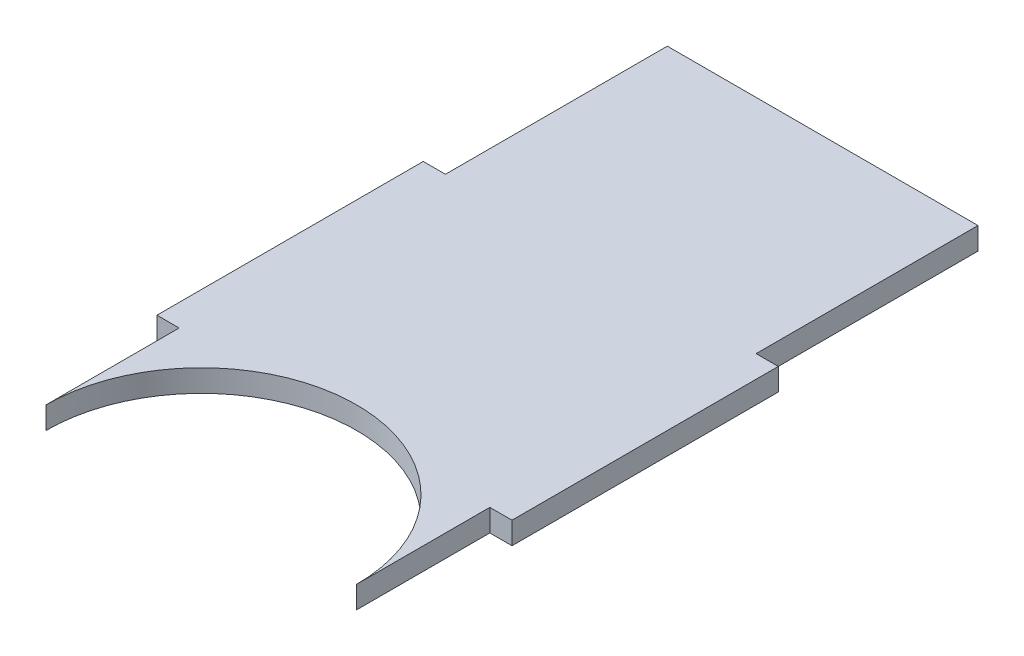
ISO-10303-21;
HEADER;
FILE_DESCRIPTION(('STEP AP214'),'2;1');
FILE_NAME('part.step','',(''),(''),'','','');
FILE_SCHEMA(('AUTOMOTIVE_DESIGN { 1 0 10303 214 1 1 1 1 }'));
ENDSEC;
DATA;
#1=APPLICATION_CONTEXT('core data for automotive mechanical design processes');
#2=APPLICATION_PROTOCOL_DEFINITION('international standard','automotive_design',2000,#1);
#3=PRODUCT_CONTEXT('',#1,'mechanical');
#4=PRODUCT('Part','Part','',(#3));
#5=PRODUCT_RELATED_PRODUCT_CATEGORY('part','',(#4));
#6=PRODUCT_DEFINITION_FORMATION('','',#4);
#7=PRODUCT_DEFINITION_CONTEXT('part definition',#1,'design');
#8=PRODUCT_DEFINITION('design','',#6,#7);
#9=PRODUCT_DEFINITION_SHAPE('','',#8);
#10=(LENGTH_UNIT() NAMED_UNIT(*) SI_UNIT(.MILLI.,.METRE.));
#11=(NAMED_UNIT(*) PLANE_ANGLE_UNIT() SI_UNIT($,.RADIAN.));
#12=(NAMED_UNIT(*) SI_UNIT($,.STERADIAN.) SOLID_ANGLE_UNIT());
#13=UNCERTAINTY_MEASURE_WITH_UNIT(LENGTH_MEASURE(1.E-05),#10,'distance_accuracy_value','');
#14=(GEOMETRIC_REPRESENTATION_CONTEXT(3) GLOBAL_UNCERTAINTY_ASSIGNED_CONTEXT((#13)) GLOBAL_UNIT_ASSIGNED_CONTEXT((#10,
#11,#12)) REPRESENTATION_CONTEXT('',''));
#15=CARTESIAN_POINT('',(0.,0.,0.));
#16=DIRECTION('',(0.,0.,1.));
#17=DIRECTION('',(1.,0.,0.));
#18=AXIS2_PLACEMENT_3D('',#15,#16,#17);
#19=CARTESIAN_POINT('',(0.,1.5875,19.05));
#20=DIRECTION('',(0.,-1.,0.));
#21=DIRECTION('',(0.,0.,-1.));
#22=AXIS2_PLACEMENT_3D('',#19,#20,#21);
#23=CYLINDRICAL_SURFACE('',#22,11.1125);
#24=CARTESIAN_POINT('',(0.,0.,19.05));
#25=DIRECTION('',(0.,1.,0.));
#26=DIRECTION('',(0.,0.,1.));
#27=AXIS2_PLACEMENT_3D('',#24,#25,#26);
#28=CIRCLE('',#27,11.1125);
#29=CARTESIAN_POINT('',(11.1125,0.,19.05));
#30=VERTEX_POINT('',#29);
#31=CARTESIAN_POINT('',(-11.1125,0.,19.05));
#32=VERTEX_POINT('',#31);
#33=EDGE_CURVE('E187',#30,#32,#28,.T.);
#34=ORIENTED_EDGE('',*,*,#33,.F.);
#35=DIRECTION('',(0.,-1.,0.));
#36=VECTOR('',#35,1.);
#37=CARTESIAN_POINT('',(11.1125,1.5875,19.05));
#38=LINE('',#37,#36);
#39=CARTESIAN_POINT('',(11.1125,1.5875,19.05));
#40=VERTEX_POINT('',#39);
#41=EDGE_CURVE('E11',#40,#30,#38,.T.);
#42=ORIENTED_EDGE('',*,*,#41,.F.);
#43=CARTESIAN_POINT('',(0.,1.5875,19.05));
#44=DIRECTION('',(0.,1.,0.));
#45=DIRECTION('',(0.,0.,1.));
#46=AXIS2_PLACEMENT_3D('',#43,#44,#45);
#47=CIRCLE('',#46,11.1125);
#48=CARTESIAN_POINT('',(-11.1125,1.5875,19.05));
#49=VERTEX_POINT('',#48);
#50=EDGE_CURVE('E266',#40,#49,#47,.T.);
#51=ORIENTED_EDGE('',*,*,#50,.T.);
#52=DIRECTION('',(0.,-1.,0.));
#53=VECTOR('',#52,1.);
#54=CARTESIAN_POINT('',(-11.1125,1.5875,19.05));
#55=LINE('',#54,#53);
#56=EDGE_CURVE('E119',#49,#32,#55,.T.);
#57=ORIENTED_EDGE('',*,*,#56,.T.);
#58=EDGE_LOOP('',(#34,#42,#51,#57));
#59=FACE_BOUND('',#58,.T.);
#60=ADVANCED_FACE('F40',(#59),#23,.F.);
#61=CARTESIAN_POINT('',(11.1125,1.5875,0.));
#62=DIRECTION('',(1.,0.,0.));
#63=DIRECTION('',(0.,0.,-1.));
#64=AXIS2_PLACEMENT_3D('',#61,#62,#63);
#65=PLANE('',#64);
#66=DIRECTION('',(0.,0.,1.));
#67=VECTOR('',#66,1.);
#68=CARTESIAN_POINT('',(11.1125,0.,0.));
#69=LINE('',#68,#67);
#70=CARTESIAN_POINT('',(11.1125,0.,9.525));
#71=VERTEX_POINT('',#70);
#72=EDGE_CURVE('E191',#71,#30,#69,.T.);
#73=ORIENTED_EDGE('',*,*,#72,.F.);
#74=DIRECTION('',(0.,-1.,0.));
#75=VECTOR('',#74,1.);
#76=CARTESIAN_POINT('',(11.1125,1.5875,9.525));
#77=LINE('',#76,#75);
#78=CARTESIAN_POINT('',(11.1125,1.5875,9.525));
#79=VERTEX_POINT('',#78);
#80=EDGE_CURVE('E49',#79,#71,#77,.T.);
#81=ORIENTED_EDGE('',*,*,#80,.F.);
#82=DIRECTION('',(0.,0.,1.));
#83=VECTOR('',#82,1.);
#84=CARTESIAN_POINT('',(11.1125,1.5875,0.));
#85=LINE('',#84,#83);
#86=EDGE_CURVE('E264',#79,#40,#85,.T.);
#87=ORIENTED_EDGE('',*,*,#86,.T.);
#88=ORIENTED_EDGE('',*,*,#41,.T.);
#89=EDGE_LOOP('',(#73,#81,#87,#88));
#90=FACE_BOUND('',#89,.T.);
#91=ADVANCED_FACE('F263',(#90),#65,.T.);
#92=CARTESIAN_POINT('',(0.,1.5875,9.52500000000003));
#93=DIRECTION('',(0.,0.,-1.));
#94=DIRECTION('',(-1.,0.,0.));
#95=AXIS2_PLACEMENT_3D('',#92,#93,#94);
#96=PLANE('',#95);
#97=DIRECTION('',(1.,0.,0.));
#98=VECTOR('',#97,1.);
#99=CARTESIAN_POINT('',(0.,0.,9.52500000000003));
#100=LINE('',#99,#98);
#101=CARTESIAN_POINT('',(12.7,0.,9.525));
#102=VERTEX_POINT('',#101);
#103=EDGE_CURVE('E195',#71,#102,#100,.T.);
#104=ORIENTED_EDGE('',*,*,#103,.T.);
#105=DIRECTION('',(0.,-1.,0.));
#106=VECTOR('',#105,1.);
#107=CARTESIAN_POINT('',(12.7,1.5875,9.525));
#108=LINE('',#107,#106);
#109=CARTESIAN_POINT('',(12.7,1.5875,9.525));
#110=VERTEX_POINT('',#109);
#111=EDGE_CURVE('E245',#110,#102,#108,.T.);
#112=ORIENTED_EDGE('',*,*,#111,.F.);
#113=DIRECTION('',(1.,0.,0.));
#114=VECTOR('',#113,1.);
#115=CARTESIAN_POINT('',(0.,1.5875,9.52500000000003));
#116=LINE('',#115,#114);
#117=EDGE_CURVE('E255',#79,#110,#116,.T.);
#118=ORIENTED_EDGE('',*,*,#117,.F.);
#119=ORIENTED_EDGE('',*,*,#80,.T.);
#120=EDGE_LOOP('',(#104,#112,#118,#119));
#121=FACE_BOUND('',#120,.T.);
#122=ADVANCED_FACE('F253',(#121),#96,.F.);
#123=CARTESIAN_POINT('',(12.7,1.5875,0.));
#124=DIRECTION('',(-1.,0.,0.));
#125=DIRECTION('',(0.,0.,1.));
#126=AXIS2_PLACEMENT_3D('',#123,#124,#125);
#127=PLANE('',#126);
#128=DIRECTION('',(0.,0.,-1.));
#129=VECTOR('',#128,1.);
#130=CARTESIAN_POINT('',(12.7,0.,0.));
#131=LINE('',#130,#129);
#132=CARTESIAN_POINT('',(12.7,0.,-9.525));
#133=VERTEX_POINT('',#132);
#134=EDGE_CURVE('E199',#102,#133,#131,.T.);
#135=ORIENTED_EDGE('',*,*,#134,.T.);
#136=DIRECTION('',(0.,-1.,0.));
#137=VECTOR('',#136,1.);
#138=CARTESIAN_POINT('',(12.7,1.5875,-9.525));
#139=LINE('',#138,#137);
#140=CARTESIAN_POINT('',(12.7,1.5875,-9.525));
#141=VERTEX_POINT('',#140);
#142=EDGE_CURVE('E242',#141,#133,#139,.T.);
#143=ORIENTED_EDGE('',*,*,#142,.F.);
#144=DIRECTION('',(0.,0.,-1.));
#145=VECTOR('',#144,1.);
#146=CARTESIAN_POINT('',(12.7,1.5875,0.));
#147=LINE('',#146,#145);
#148=EDGE_CURVE('E275',#110,#141,#147,.T.);
#149=ORIENTED_EDGE('',*,*,#148,.F.);
#150=ORIENTED_EDGE('',*,*,#111,.T.);
#151=EDGE_LOOP('',(#135,#143,#149,#150));
#152=FACE_BOUND('',#151,.T.);
#153=ADVANCED_FACE('F312',(#152),#127,.F.);
#154=CARTESIAN_POINT('',(0.,1.5875,-9.52500000000003));
#155=DIRECTION('',(0.,0.,-1.));
#156=DIRECTION('',(-1.,0.,0.));
#157=AXIS2_PLACEMENT_3D('',#154,#155,#156);
#158=PLANE('',#157);
#159=DIRECTION('',(1.,0.,0.));
#160=VECTOR('',#159,1.);
#161=CARTESIAN_POINT('',(0.,0.,-9.52500000000003));
#162=LINE('',#161,#160);
#163=CARTESIAN_POINT('',(11.1125,0.,-9.525));
#164=VERTEX_POINT('',#163);
#165=EDGE_CURVE('E203',#164,#133,#162,.T.);
#166=ORIENTED_EDGE('',*,*,#165,.F.);
#167=DIRECTION('',(0.,-1.,0.));
#168=VECTOR('',#167,1.);
#169=CARTESIAN_POINT('',(11.1125,1.5875,-9.525));
#170=LINE('',#169,#168);
#171=CARTESIAN_POINT('',(11.1125,1.5875,-9.525));
#172=VERTEX_POINT('',#171);
#173=EDGE_CURVE('E239',#172,#164,#170,.T.);
#174=ORIENTED_EDGE('',*,*,#173,.F.);
#175=DIRECTION('',(1.,0.,0.));
#176=VECTOR('',#175,1.);
#177=CARTESIAN_POINT('',(0.,1.5875,-9.52500000000003));
#178=LINE('',#177,#176);
#179=EDGE_CURVE('E277',#172,#141,#178,.T.);
#180=ORIENTED_EDGE('',*,*,#179,.T.);
#181=ORIENTED_EDGE('',*,*,#142,.T.);
#182=EDGE_LOOP('',(#166,#174,#180,#181));
#183=FACE_BOUND('',#182,.T.);
#184=ADVANCED_FACE('F310',(#183),#158,.T.);
#185=CARTESIAN_POINT('',(11.1125,0.,-25.4));
#186=VERTEX_POINT('',#185);
#187=EDGE_CURVE('E196',#186,#164,#69,.T.);
#188=ORIENTED_EDGE('',*,*,#187,.F.);
#189=DIRECTION('',(0.,-1.,0.));
#190=VECTOR('',#189,1.);
#191=CARTESIAN_POINT('',(11.1125,1.5875,-25.4));
#192=LINE('',#191,#190);
#193=CARTESIAN_POINT('',(11.1125,1.5875,-25.4));
#194=VERTEX_POINT('',#193);
#195=EDGE_CURVE('E236',#194,#186,#192,.T.);
#196=ORIENTED_EDGE('',*,*,#195,.F.);
#197=EDGE_CURVE('E271',#194,#172,#85,.T.);
#198=ORIENTED_EDGE('',*,*,#197,.T.);
#199=ORIENTED_EDGE('',*,*,#173,.T.);
#200=EDGE_LOOP('',(#188,#196,#198,#199));
#201=FACE_BOUND('',#200,.T.);
#202=ADVANCED_FACE('F301',(#201),#65,.T.);
#203=CARTESIAN_POINT('',(0.,1.5875,-25.4));
#204=DIRECTION('',(0.,0.,1.));
#205=DIRECTION('',(1.,0.,0.));
#206=AXIS2_PLACEMENT_3D('',#203,#204,#205);
#207=PLANE('',#206);
#208=DIRECTION('',(-1.,0.,0.));
#209=VECTOR('',#208,1.);
#210=CARTESIAN_POINT('',(0.,0.,-25.4));
#211=LINE('',#210,#209);
#212=CARTESIAN_POINT('',(-11.1125,0.,-25.4));
#213=VERTEX_POINT('',#212);
#214=EDGE_CURVE('E207',#186,#213,#211,.T.);
#215=ORIENTED_EDGE('',*,*,#214,.T.);
#216=DIRECTION('',(0.,-1.,0.));
#217=VECTOR('',#216,1.);
#218=CARTESIAN_POINT('',(-11.1125,1.5875,-25.4));
#219=LINE('',#218,#217);
#220=CARTESIAN_POINT('',(-11.1125,1.5875,-25.4));
#221=VERTEX_POINT('',#220);
#222=EDGE_CURVE('E232',#221,#213,#219,.T.);
#223=ORIENTED_EDGE('',*,*,#222,.F.);
#224=DIRECTION('',(-1.,0.,0.));
#225=VECTOR('',#224,1.);
#226=CARTESIAN_POINT('',(0.,1.5875,-25.4));
#227=LINE('',#226,#225);
#228=EDGE_CURVE('E281',#194,#221,#227,.T.);
#229=ORIENTED_EDGE('',*,*,#228,.F.);
#230=ORIENTED_EDGE('',*,*,#195,.T.);
#231=EDGE_LOOP('',(#215,#223,#229,#230));
#232=FACE_BOUND('',#231,.T.);
#233=ADVANCED_FACE('F329',(#232),#207,.F.);
#234=CARTESIAN_POINT('',(-11.1125,1.5875,0.));
#235=DIRECTION('',(1.,0.,0.));
#236=DIRECTION('',(0.,0.,-1.));
#237=AXIS2_PLACEMENT_3D('',#234,#235,#236);
#238=PLANE('',#237);
#239=DIRECTION('',(0.,0.,1.));
#240=VECTOR('',#239,1.);
#241=CARTESIAN_POINT('',(-11.1125,0.,0.));
#242=LINE('',#241,#240);
#243=CARTESIAN_POINT('',(-11.1125,0.,-9.525));
#244=VERTEX_POINT('',#243);
#245=EDGE_CURVE('E210',#213,#244,#242,.T.);
#246=ORIENTED_EDGE('',*,*,#245,.T.);
#247=DIRECTION('',(0.,-1.,0.));
#248=VECTOR('',#247,1.);
#249=CARTESIAN_POINT('',(-11.1125,1.5875,-9.525));
#250=LINE('',#249,#248);
#251=CARTESIAN_POINT('',(-11.1125,1.5875,-9.525));
#252=VERTEX_POINT('',#251);
#253=EDGE_CURVE('E228',#252,#244,#250,.T.);
#254=ORIENTED_EDGE('',*,*,#253,.F.);
#255=DIRECTION('',(0.,0.,1.));
#256=VECTOR('',#255,1.);
#257=CARTESIAN_POINT('',(-11.1125,1.5875,0.));
#258=LINE('',#257,#256);
#259=EDGE_CURVE('E184',#221,#252,#258,.T.);
#260=ORIENTED_EDGE('',*,*,#259,.F.);
#261=ORIENTED_EDGE('',*,*,#222,.T.);
#262=EDGE_LOOP('',(#246,#254,#260,#261));
#263=FACE_BOUND('',#262,.T.);
#264=ADVANCED_FACE('F291',(#263),#238,.F.);
#265=CARTESIAN_POINT('',(0.,1.5875,-9.52500000000003));
#266=DIRECTION('',(0.,0.,1.));
#267=DIRECTION('',(1.,0.,0.));
#268=AXIS2_PLACEMENT_3D('',#265,#266,#267);
#269=PLANE('',#268);
#270=DIRECTION('',(-1.,0.,0.));
#271=VECTOR('',#270,1.);
#272=CARTESIAN_POINT('',(0.,0.,-9.52500000000003));
#273=LINE('',#272,#271);
#274=CARTESIAN_POINT('',(-12.7,0.,-9.525));
#275=VERTEX_POINT('',#274);
#276=EDGE_CURVE('E213',#244,#275,#273,.T.);
#277=ORIENTED_EDGE('',*,*,#276,.T.);
#278=DIRECTION('',(0.,-1.,0.));
#279=VECTOR('',#278,1.);
#280=CARTESIAN_POINT('',(-12.7,1.5875,-9.525));
#281=LINE('',#280,#279);
#282=CARTESIAN_POINT('',(-12.7,1.5875,-9.525));
#283=VERTEX_POINT('',#282);
#284=EDGE_CURVE('E169',#283,#275,#281,.T.);
#285=ORIENTED_EDGE('',*,*,#284,.F.);
#286=DIRECTION('',(-1.,0.,0.));
#287=VECTOR('',#286,1.);
#288=CARTESIAN_POINT('',(0.,1.5875,-9.52500000000003));
#289=LINE('',#288,#287);
#290=EDGE_CURVE('E174',#252,#283,#289,.T.);
#291=ORIENTED_EDGE('',*,*,#290,.F.);
#292=ORIENTED_EDGE('',*,*,#253,.T.);
#293=EDGE_LOOP('',(#277,#285,#291,#292));
#294=FACE_BOUND('',#293,.T.);
#295=ADVANCED_FACE('F295',(#294),#269,.F.);
#296=CARTESIAN_POINT('',(-12.7,1.5875,0.));
#297=DIRECTION('',(-1.,0.,0.));
#298=DIRECTION('',(0.,0.,1.));
#299=AXIS2_PLACEMENT_3D('',#296,#297,#298);
#300=PLANE('',#299);
#301=DIRECTION('',(0.,0.,-1.));
#302=VECTOR('',#301,1.);
#303=CARTESIAN_POINT('',(-12.7,0.,0.));
#304=LINE('',#303,#302);
#305=CARTESIAN_POINT('',(-12.7,0.,9.525));
#306=VERTEX_POINT('',#305);
#307=EDGE_CURVE('E163',#306,#275,#304,.T.);
#308=ORIENTED_EDGE('',*,*,#307,.F.);
#309=DIRECTION('',(0.,-1.,0.));
#310=VECTOR('',#309,1.);
#311=CARTESIAN_POINT('',(-12.7,1.5875,9.525));
#312=LINE('',#311,#310);
#313=CARTESIAN_POINT('',(-12.7,1.5875,9.525));
#314=VERTEX_POINT('',#313);
#315=EDGE_CURVE('E158',#314,#306,#312,.T.);
#316=ORIENTED_EDGE('',*,*,#315,.F.);
#317=DIRECTION('',(0.,0.,-1.));
#318=VECTOR('',#317,1.);
#319=CARTESIAN_POINT('',(-12.7,1.5875,0.));
#320=LINE('',#319,#318);
#321=EDGE_CURVE('E161',#314,#283,#320,.T.);
#322=ORIENTED_EDGE('',*,*,#321,.T.);
#323=ORIENTED_EDGE('',*,*,#284,.T.);
#324=EDGE_LOOP('',(#308,#316,#322,#323));
#325=FACE_BOUND('',#324,.T.);
#326=ADVANCED_FACE('F160',(#325),#300,.T.);
#327=CARTESIAN_POINT('',(0.,1.5875,9.52500000000003));
#328=DIRECTION('',(0.,0.,1.));
#329=DIRECTION('',(1.,0.,0.));
#330=AXIS2_PLACEMENT_3D('',#327,#328,#329);
#331=PLANE('',#330);
#332=DIRECTION('',(-1.,0.,0.));
#333=VECTOR('',#332,1.);
#334=CARTESIAN_POINT('',(0.,0.,9.52500000000003));
#335=LINE('',#334,#333);
#336=CARTESIAN_POINT('',(-11.1125,0.,9.525));
#337=VERTEX_POINT('',#336);
#338=EDGE_CURVE('E220',#337,#306,#335,.T.);
#339=ORIENTED_EDGE('',*,*,#338,.F.);
#340=DIRECTION('',(0.,-1.,0.));
#341=VECTOR('',#340,1.);
#342=CARTESIAN_POINT('',(-11.1125,1.5875,9.525));
#343=LINE('',#342,#341);
#344=CARTESIAN_POINT('',(-11.1125,1.5875,9.525));
#345=VERTEX_POINT('',#344);
#346=EDGE_CURVE('E111',#345,#337,#343,.T.);
#347=ORIENTED_EDGE('',*,*,#346,.F.);
#348=DIRECTION('',(-1.,0.,0.));
#349=VECTOR('',#348,1.);
#350=CARTESIAN_POINT('',(0.,1.5875,9.52500000000003));
#351=LINE('',#350,#349);
#352=EDGE_CURVE('E172',#345,#314,#351,.T.);
#353=ORIENTED_EDGE('',*,*,#352,.T.);
#354=ORIENTED_EDGE('',*,*,#315,.T.);
#355=EDGE_LOOP('',(#339,#347,#353,#354));
#356=FACE_BOUND('',#355,.T.);
#357=ADVANCED_FACE('F178',(#356),#331,.T.);
#358=EDGE_CURVE('E214',#337,#32,#242,.T.);
#359=ORIENTED_EDGE('',*,*,#358,.T.);
#360=ORIENTED_EDGE('',*,*,#56,.F.);
#361=EDGE_CURVE('E60',#345,#49,#258,.T.);
#362=ORIENTED_EDGE('',*,*,#361,.F.);
#363=ORIENTED_EDGE('',*,*,#346,.T.);
#364=EDGE_LOOP('',(#359,#360,#362,#363));
#365=FACE_BOUND('',#364,.T.);
#366=ADVANCED_FACE('F337',(#365),#238,.F.);
#367=CARTESIAN_POINT('',(0.,1.5875,0.));
#368=DIRECTION('',(0.,1.,0.));
#369=DIRECTION('',(0.,0.,1.));
#370=AXIS2_PLACEMENT_3D('',#367,#368,#369);
#371=PLANE('',#370);
#372=ORIENTED_EDGE('',*,*,#50,.F.);
#373=ORIENTED_EDGE('',*,*,#86,.F.);
#374=ORIENTED_EDGE('',*,*,#117,.T.);
#375=ORIENTED_EDGE('',*,*,#148,.T.);
#376=ORIENTED_EDGE('',*,*,#179,.F.);
#377=ORIENTED_EDGE('',*,*,#197,.F.);
#378=ORIENTED_EDGE('',*,*,#228,.T.);
#379=ORIENTED_EDGE('',*,*,#259,.T.);
#380=ORIENTED_EDGE('',*,*,#290,.T.);
#381=ORIENTED_EDGE('',*,*,#321,.F.);
#382=ORIENTED_EDGE('',*,*,#352,.F.);
#383=ORIENTED_EDGE('',*,*,#361,.T.);
#384=EDGE_LOOP('',(#372,#373,#374,#375,#376,#377,#378,#379,#380,#381,#382,#383));
#385=FACE_BOUND('',#384,.T.);
#386=ADVANCED_FACE('F171',(#385),#371,.T.);
#387=CARTESIAN_POINT('',(0.,0.,0.));
#388=DIRECTION('',(0.,1.,0.));
#389=DIRECTION('',(0.,0.,1.));
#390=AXIS2_PLACEMENT_3D('',#387,#388,#389);
#391=PLANE('',#390);
#392=ORIENTED_EDGE('',*,*,#33,.T.);
#393=ORIENTED_EDGE('',*,*,#358,.F.);
#394=ORIENTED_EDGE('',*,*,#338,.T.);
#395=ORIENTED_EDGE('',*,*,#307,.T.);
#396=ORIENTED_EDGE('',*,*,#276,.F.);
#397=ORIENTED_EDGE('',*,*,#245,.F.);
#398=ORIENTED_EDGE('',*,*,#214,.F.);
#399=ORIENTED_EDGE('',*,*,#187,.T.);
#400=ORIENTED_EDGE('',*,*,#165,.T.);
#401=ORIENTED_EDGE('',*,*,#134,.F.);
#402=ORIENTED_EDGE('',*,*,#103,.F.);
#403=ORIENTED_EDGE('',*,*,#72,.T.);
#404=EDGE_LOOP('',(#392,#393,#394,#395,#396,#397,#398,#399,#400,#401,#402,#403));
#405=FACE_BOUND('',#404,.T.);
#406=ADVANCED_FACE('F262',(#405),#391,.F.);
#407=CLOSED_SHELL('',(#60,#91,#122,#153,#184,#202,#233,#264,#295,#326,#357,#366,#386,#406));
#408=MANIFOLD_SOLID_BREP('B2',#407);
#409=ADVANCED_BREP_SHAPE_REPRESENTATION('',(#18,#408),#14);
#410=SHAPE_DEFINITION_REPRESENTATION(#9,#409);
ENDSEC;
END-ISO-10303-21;
